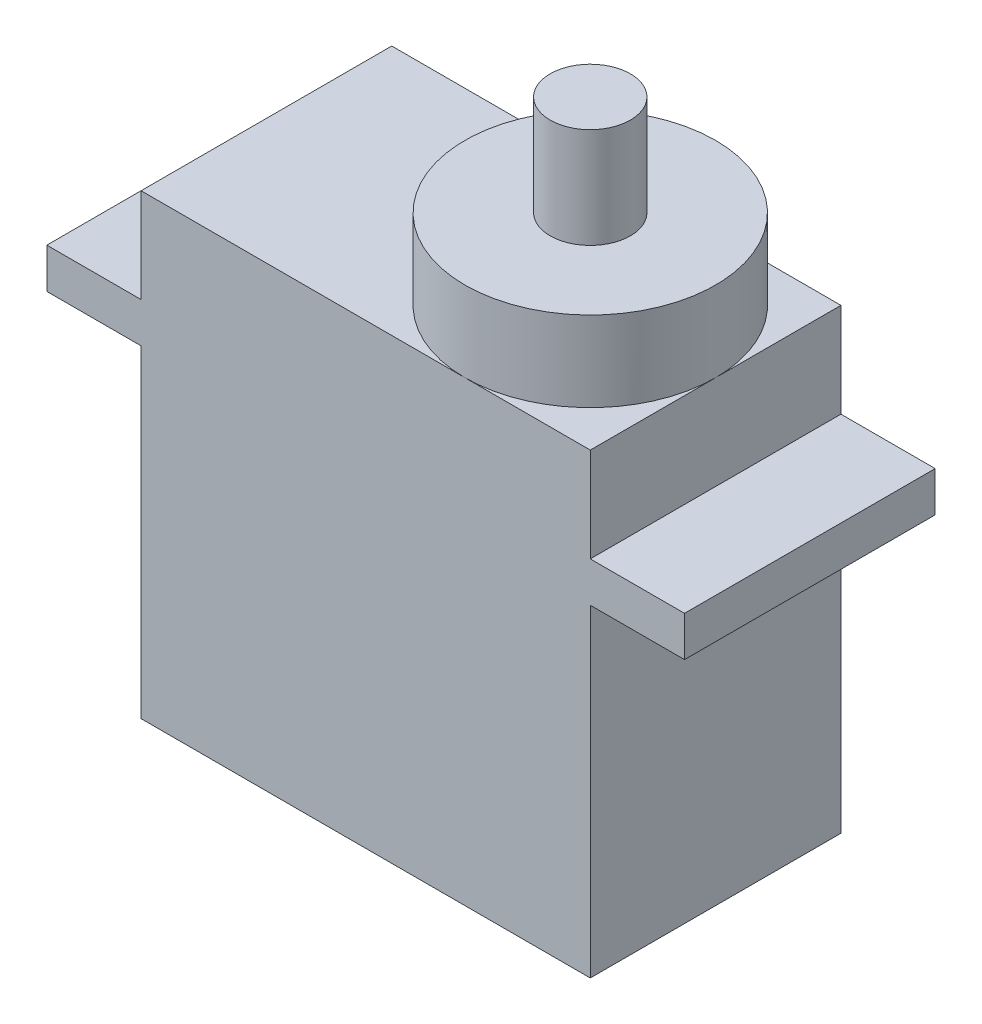
ISO-10303-21;
HEADER;
FILE_DESCRIPTION(('STEP AP214'),'2;1');
FILE_NAME('part.step','',(''),(''),'','','');
FILE_SCHEMA(('AUTOMOTIVE_DESIGN { 1 0 10303 214 1 1 1 1 }'));
ENDSEC;
DATA;
#1=APPLICATION_CONTEXT('core data for automotive mechanical design processes');
#2=APPLICATION_PROTOCOL_DEFINITION('international standard','automotive_design',2000,#1);
#3=PRODUCT_CONTEXT('',#1,'mechanical');
#4=PRODUCT('Part','Part','',(#3));
#5=PRODUCT_RELATED_PRODUCT_CATEGORY('part','',(#4));
#6=PRODUCT_DEFINITION_FORMATION('','',#4);
#7=PRODUCT_DEFINITION_CONTEXT('part definition',#1,'design');
#8=PRODUCT_DEFINITION('design','',#6,#7);
#9=PRODUCT_DEFINITION_SHAPE('','',#8);
#10=(LENGTH_UNIT() NAMED_UNIT(*) SI_UNIT(.MILLI.,.METRE.));
#11=(NAMED_UNIT(*) PLANE_ANGLE_UNIT() SI_UNIT($,.RADIAN.));
#12=(NAMED_UNIT(*) SI_UNIT($,.STERADIAN.) SOLID_ANGLE_UNIT());
#13=UNCERTAINTY_MEASURE_WITH_UNIT(LENGTH_MEASURE(1.E-05),#10,'distance_accuracy_value','');
#14=(GEOMETRIC_REPRESENTATION_CONTEXT(3) GLOBAL_UNCERTAINTY_ASSIGNED_CONTEXT((#13)) GLOBAL_UNIT_ASSIGNED_CONTEXT((#10,
#11,#12)) REPRESENTATION_CONTEXT('',''));
#15=CARTESIAN_POINT('',(0.,0.,0.));
#16=DIRECTION('',(0.,0.,1.));
#17=DIRECTION('',(1.,0.,0.));
#18=AXIS2_PLACEMENT_3D('',#15,#16,#17);
#19=CARTESIAN_POINT('',(11.2,11.4,6.25));
#20=DIRECTION('',(0.,-1.,0.));
#21=DIRECTION('',(0.,0.,-1.));
#22=AXIS2_PLACEMENT_3D('',#19,#20,#21);
#23=PLANE('',#22);
#24=CARTESIAN_POINT('',(4.95,11.4,0.));
#25=DIRECTION('',(0.,1.,0.));
#26=DIRECTION('',(0.,0.,1.));
#27=AXIS2_PLACEMENT_3D('',#24,#25,#26);
#28=CIRCLE('',#27,6.25);
#29=CARTESIAN_POINT('',(4.95,11.4,6.25));
#30=VERTEX_POINT('',#29);
#31=CARTESIAN_POINT('',(11.2,11.4,0.));
#32=VERTEX_POINT('',#31);
#33=EDGE_CURVE('E154',#30,#32,#28,.T.);
#34=ORIENTED_EDGE('',*,*,#33,.F.);
#35=DIRECTION('',(-1.,0.,0.));
#36=VECTOR('',#35,1.);
#37=CARTESIAN_POINT('',(11.2,11.4,6.25));
#38=LINE('',#37,#36);
#39=CARTESIAN_POINT('',(11.2,11.4,6.25));
#40=VERTEX_POINT('',#39);
#41=EDGE_CURVE('E135',#40,#30,#38,.T.);
#42=ORIENTED_EDGE('',*,*,#41,.F.);
#43=DIRECTION('',(0.,0.,-1.));
#44=VECTOR('',#43,1.);
#45=CARTESIAN_POINT('',(11.2,11.4,6.25));
#46=LINE('',#45,#44);
#47=EDGE_CURVE('E155',#40,#32,#46,.T.);
#48=ORIENTED_EDGE('',*,*,#47,.T.);
#49=EDGE_LOOP('',(#34,#42,#48));
#50=FACE_BOUND('',#49,.T.);
#51=ADVANCED_FACE('F35',(#50),#23,.F.);
#52=CARTESIAN_POINT('',(4.95,11.4,-6.25));
#53=VERTEX_POINT('',#52);
#54=EDGE_CURVE('E44',#32,#53,#28,.T.);
#55=ORIENTED_EDGE('',*,*,#54,.F.);
#56=CARTESIAN_POINT('',(11.2,11.4,-6.25));
#57=VERTEX_POINT('',#56);
#58=EDGE_CURVE('E237',#32,#57,#46,.T.);
#59=ORIENTED_EDGE('',*,*,#58,.T.);
#60=DIRECTION('',(-1.,0.,0.));
#61=VECTOR('',#60,1.);
#62=CARTESIAN_POINT('',(11.2,11.4,-6.25));
#63=LINE('',#62,#61);
#64=EDGE_CURVE('E234',#57,#53,#63,.T.);
#65=ORIENTED_EDGE('',*,*,#64,.T.);
#66=EDGE_LOOP('',(#55,#59,#65));
#67=FACE_BOUND('',#66,.T.);
#68=ADVANCED_FACE('F282',(#67),#23,.F.);
#69=CARTESIAN_POINT('',(11.2,-11.4,6.25));
#70=DIRECTION('',(-1.,0.,0.));
#71=DIRECTION('',(0.,-1.,0.));
#72=AXIS2_PLACEMENT_3D('',#69,#70,#71);
#73=PLANE('',#72);
#74=DIRECTION('',(0.,0.,1.));
#75=VECTOR('',#74,1.);
#76=CARTESIAN_POINT('',(11.2,6.7,-6.25));
#77=LINE('',#76,#75);
#78=CARTESIAN_POINT('',(11.2,6.7,-6.25));
#79=VERTEX_POINT('',#78);
#80=CARTESIAN_POINT('',(11.2,6.7,6.25));
#81=VERTEX_POINT('',#80);
#82=EDGE_CURVE('E174',#79,#81,#77,.T.);
#83=ORIENTED_EDGE('',*,*,#82,.F.);
#84=DIRECTION('',(0.,1.,0.));
#85=VECTOR('',#84,1.);
#86=CARTESIAN_POINT('',(11.2,-11.4,-6.25));
#87=LINE('',#86,#85);
#88=EDGE_CURVE('E229',#79,#57,#87,.T.);
#89=ORIENTED_EDGE('',*,*,#88,.T.);
#90=ORIENTED_EDGE('',*,*,#58,.F.);
#91=ORIENTED_EDGE('',*,*,#47,.F.);
#92=DIRECTION('',(0.,1.,0.));
#93=VECTOR('',#92,1.);
#94=CARTESIAN_POINT('',(11.2,-11.4,6.25));
#95=LINE('',#94,#93);
#96=EDGE_CURVE('E142',#81,#40,#95,.T.);
#97=ORIENTED_EDGE('',*,*,#96,.F.);
#98=EDGE_LOOP('',(#83,#89,#90,#91,#97));
#99=FACE_BOUND('',#98,.T.);
#100=ADVANCED_FACE('F280',(#99),#73,.F.);
#101=CARTESIAN_POINT('',(-11.2,-11.4,6.25));
#102=DIRECTION('',(1.,0.,0.));
#103=DIRECTION('',(0.,0.,-1.));
#104=AXIS2_PLACEMENT_3D('',#101,#102,#103);
#105=PLANE('',#104);
#106=DIRECTION('',(0.,0.,1.));
#107=VECTOR('',#106,1.);
#108=CARTESIAN_POINT('',(-11.2,4.7,-6.25));
#109=LINE('',#108,#107);
#110=CARTESIAN_POINT('',(-11.2,4.7,-6.25));
#111=VERTEX_POINT('',#110);
#112=CARTESIAN_POINT('',(-11.2,4.7,6.25));
#113=VERTEX_POINT('',#112);
#114=EDGE_CURVE('E208',#111,#113,#109,.T.);
#115=ORIENTED_EDGE('',*,*,#114,.F.);
#116=DIRECTION('',(0.,-1.,0.));
#117=VECTOR('',#116,1.);
#118=CARTESIAN_POINT('',(-11.2,-11.4,-6.25));
#119=LINE('',#118,#117);
#120=CARTESIAN_POINT('',(-11.2,-11.4,-6.25));
#121=VERTEX_POINT('',#120);
#122=EDGE_CURVE('E210',#111,#121,#119,.T.);
#123=ORIENTED_EDGE('',*,*,#122,.T.);
#124=DIRECTION('',(0.,0.,-1.));
#125=VECTOR('',#124,1.);
#126=CARTESIAN_POINT('',(-11.2,-11.4,6.25));
#127=LINE('',#126,#125);
#128=CARTESIAN_POINT('',(-11.2,-11.4,6.25));
#129=VERTEX_POINT('',#128);
#130=EDGE_CURVE('E39',#129,#121,#127,.T.);
#131=ORIENTED_EDGE('',*,*,#130,.F.);
#132=DIRECTION('',(0.,-1.,0.));
#133=VECTOR('',#132,1.);
#134=CARTESIAN_POINT('',(-11.2,-11.4,6.25));
#135=LINE('',#134,#133);
#136=EDGE_CURVE('E220',#113,#129,#135,.T.);
#137=ORIENTED_EDGE('',*,*,#136,.F.);
#138=EDGE_LOOP('',(#115,#123,#131,#137));
#139=FACE_BOUND('',#138,.T.);
#140=ADVANCED_FACE('F262',(#139),#105,.F.);
#141=CARTESIAN_POINT('',(-11.2,11.4,-6.25));
#142=VERTEX_POINT('',#141);
#143=CARTESIAN_POINT('',(-11.2,6.7,-6.25));
#144=VERTEX_POINT('',#143);
#145=EDGE_CURVE('E224',#142,#144,#119,.T.);
#146=ORIENTED_EDGE('',*,*,#145,.T.);
#147=DIRECTION('',(0.,0.,1.));
#148=VECTOR('',#147,1.);
#149=CARTESIAN_POINT('',(-11.2,6.7,-6.25));
#150=LINE('',#149,#148);
#151=CARTESIAN_POINT('',(-11.2,6.7,6.25));
#152=VERTEX_POINT('',#151);
#153=EDGE_CURVE('E200',#144,#152,#150,.T.);
#154=ORIENTED_EDGE('',*,*,#153,.T.);
#155=CARTESIAN_POINT('',(-11.2,11.4,6.25));
#156=VERTEX_POINT('',#155);
#157=EDGE_CURVE('E217',#156,#152,#135,.T.);
#158=ORIENTED_EDGE('',*,*,#157,.F.);
#159=DIRECTION('',(0.,0.,-1.));
#160=VECTOR('',#159,1.);
#161=CARTESIAN_POINT('',(-11.2,11.4,6.25));
#162=LINE('',#161,#160);
#163=EDGE_CURVE('E147',#156,#142,#162,.T.);
#164=ORIENTED_EDGE('',*,*,#163,.T.);
#165=EDGE_LOOP('',(#146,#154,#158,#164));
#166=FACE_BOUND('',#165,.T.);
#167=ADVANCED_FACE('F37',(#166),#105,.F.);
#168=CARTESIAN_POINT('',(11.2,-11.4,6.25));
#169=DIRECTION('',(0.,1.,0.));
#170=DIRECTION('',(0.,0.,1.));
#171=AXIS2_PLACEMENT_3D('',#168,#169,#170);
#172=PLANE('',#171);
#173=DIRECTION('',(1.,0.,0.));
#174=VECTOR('',#173,1.);
#175=CARTESIAN_POINT('',(11.2,-11.4,-6.25));
#176=LINE('',#175,#174);
#177=CARTESIAN_POINT('',(11.2,-11.4,-6.25));
#178=VERTEX_POINT('',#177);
#179=EDGE_CURVE('E227',#121,#178,#176,.T.);
#180=ORIENTED_EDGE('',*,*,#179,.T.);
#181=DIRECTION('',(0.,0.,-1.));
#182=VECTOR('',#181,1.);
#183=CARTESIAN_POINT('',(11.2,-11.4,6.25));
#184=LINE('',#183,#182);
#185=CARTESIAN_POINT('',(11.2,-11.4,6.25));
#186=VERTEX_POINT('',#185);
#187=EDGE_CURVE('E162',#186,#178,#184,.T.);
#188=ORIENTED_EDGE('',*,*,#187,.F.);
#189=DIRECTION('',(1.,0.,0.));
#190=VECTOR('',#189,1.);
#191=CARTESIAN_POINT('',(11.2,-11.4,6.25));
#192=LINE('',#191,#190);
#193=EDGE_CURVE('E219',#129,#186,#192,.T.);
#194=ORIENTED_EDGE('',*,*,#193,.F.);
#195=ORIENTED_EDGE('',*,*,#130,.T.);
#196=EDGE_LOOP('',(#180,#188,#194,#195));
#197=FACE_BOUND('',#196,.T.);
#198=ADVANCED_FACE('F259',(#197),#172,.F.);
#199=CARTESIAN_POINT('',(11.2,4.7,-6.25));
#200=VERTEX_POINT('',#199);
#201=EDGE_CURVE('E230',#178,#200,#87,.T.);
#202=ORIENTED_EDGE('',*,*,#201,.T.);
#203=DIRECTION('',(0.,0.,1.));
#204=VECTOR('',#203,1.);
#205=CARTESIAN_POINT('',(11.2,4.7,-6.25));
#206=LINE('',#205,#204);
#207=CARTESIAN_POINT('',(11.2,4.7,6.25));
#208=VERTEX_POINT('',#207);
#209=EDGE_CURVE('E187',#200,#208,#206,.T.);
#210=ORIENTED_EDGE('',*,*,#209,.T.);
#211=EDGE_CURVE('E152',#186,#208,#95,.T.);
#212=ORIENTED_EDGE('',*,*,#211,.F.);
#213=ORIENTED_EDGE('',*,*,#187,.T.);
#214=EDGE_LOOP('',(#202,#210,#212,#213));
#215=FACE_BOUND('',#214,.T.);
#216=ADVANCED_FACE('F243',(#215),#73,.F.);
#217=EDGE_CURVE('E59',#53,#30,#28,.T.);
#218=ORIENTED_EDGE('',*,*,#217,.F.);
#219=EDGE_CURVE('E233',#53,#142,#63,.T.);
#220=ORIENTED_EDGE('',*,*,#219,.T.);
#221=ORIENTED_EDGE('',*,*,#163,.F.);
#222=EDGE_CURVE('E138',#30,#156,#38,.T.);
#223=ORIENTED_EDGE('',*,*,#222,.F.);
#224=EDGE_LOOP('',(#218,#220,#221,#223));
#225=FACE_BOUND('',#224,.T.);
#226=ADVANCED_FACE('F149',(#225),#23,.F.);
#227=CARTESIAN_POINT('',(0.,0.,6.25));
#228=DIRECTION('',(0.,0.,1.));
#229=DIRECTION('',(1.,0.,0.));
#230=AXIS2_PLACEMENT_3D('',#227,#228,#229);
#231=PLANE('',#230);
#232=ORIENTED_EDGE('',*,*,#157,.T.);
#233=DIRECTION('',(-1.,0.,0.));
#234=VECTOR('',#233,1.);
#235=CARTESIAN_POINT('',(-15.9,6.7,6.25));
#236=LINE('',#235,#234);
#237=CARTESIAN_POINT('',(-15.9,6.7,6.25));
#238=VERTEX_POINT('',#237);
#239=EDGE_CURVE('E184',#152,#238,#236,.T.);
#240=ORIENTED_EDGE('',*,*,#239,.T.);
#241=DIRECTION('',(0.,-1.,0.));
#242=VECTOR('',#241,1.);
#243=CARTESIAN_POINT('',(-15.9,4.7,6.25));
#244=LINE('',#243,#242);
#245=CARTESIAN_POINT('',(-15.9,4.7,6.25));
#246=VERTEX_POINT('',#245);
#247=EDGE_CURVE('E203',#238,#246,#244,.T.);
#248=ORIENTED_EDGE('',*,*,#247,.T.);
#249=DIRECTION('',(1.,0.,0.));
#250=VECTOR('',#249,1.);
#251=CARTESIAN_POINT('',(-11.2,4.7,6.25));
#252=LINE('',#251,#250);
#253=EDGE_CURVE('E195',#246,#113,#252,.T.);
#254=ORIENTED_EDGE('',*,*,#253,.T.);
#255=ORIENTED_EDGE('',*,*,#136,.T.);
#256=ORIENTED_EDGE('',*,*,#193,.T.);
#257=ORIENTED_EDGE('',*,*,#211,.T.);
#258=DIRECTION('',(1.,0.,0.));
#259=VECTOR('',#258,1.);
#260=CARTESIAN_POINT('',(11.2,4.7,6.25));
#261=LINE('',#260,#259);
#262=CARTESIAN_POINT('',(15.9,4.7,6.25));
#263=VERTEX_POINT('',#262);
#264=EDGE_CURVE('E177',#208,#263,#261,.T.);
#265=ORIENTED_EDGE('',*,*,#264,.T.);
#266=DIRECTION('',(0.,1.,0.));
#267=VECTOR('',#266,1.);
#268=CARTESIAN_POINT('',(15.9,4.7,6.25));
#269=LINE('',#268,#267);
#270=CARTESIAN_POINT('',(15.9,6.7,6.25));
#271=VERTEX_POINT('',#270);
#272=EDGE_CURVE('E168',#263,#271,#269,.T.);
#273=ORIENTED_EDGE('',*,*,#272,.T.);
#274=DIRECTION('',(-1.,0.,0.));
#275=VECTOR('',#274,1.);
#276=CARTESIAN_POINT('',(15.9,6.7,6.25));
#277=LINE('',#276,#275);
#278=EDGE_CURVE('E175',#271,#81,#277,.T.);
#279=ORIENTED_EDGE('',*,*,#278,.T.);
#280=ORIENTED_EDGE('',*,*,#96,.T.);
#281=ORIENTED_EDGE('',*,*,#41,.T.);
#282=ORIENTED_EDGE('',*,*,#222,.T.);
#283=EDGE_LOOP('',(#232,#240,#248,#254,#255,#256,#257,#265,#273,#279,#280,#281,#282));
#284=FACE_BOUND('',#283,.T.);
#285=ADVANCED_FACE('F137',(#284),#231,.T.);
#286=CARTESIAN_POINT('',(0.,0.,-6.25));
#287=DIRECTION('',(0.,0.,1.));
#288=DIRECTION('',(1.,0.,0.));
#289=AXIS2_PLACEMENT_3D('',#286,#287,#288);
#290=PLANE('',#289);
#291=ORIENTED_EDGE('',*,*,#145,.F.);
#292=ORIENTED_EDGE('',*,*,#219,.F.);
#293=ORIENTED_EDGE('',*,*,#64,.F.);
#294=ORIENTED_EDGE('',*,*,#88,.F.);
#295=DIRECTION('',(-1.,0.,0.));
#296=VECTOR('',#295,1.);
#297=CARTESIAN_POINT('',(15.9,6.7,-6.25));
#298=LINE('',#297,#296);
#299=CARTESIAN_POINT('',(15.9,6.7,-6.25));
#300=VERTEX_POINT('',#299);
#301=EDGE_CURVE('E165',#300,#79,#298,.T.);
#302=ORIENTED_EDGE('',*,*,#301,.F.);
#303=DIRECTION('',(0.,1.,0.));
#304=VECTOR('',#303,1.);
#305=CARTESIAN_POINT('',(15.9,4.7,-6.25));
#306=LINE('',#305,#304);
#307=CARTESIAN_POINT('',(15.9,4.7,-6.25));
#308=VERTEX_POINT('',#307);
#309=EDGE_CURVE('E171',#308,#300,#306,.T.);
#310=ORIENTED_EDGE('',*,*,#309,.F.);
#311=DIRECTION('',(1.,0.,0.));
#312=VECTOR('',#311,1.);
#313=CARTESIAN_POINT('',(11.2,4.7,-6.25));
#314=LINE('',#313,#312);
#315=EDGE_CURVE('E167',#200,#308,#314,.T.);
#316=ORIENTED_EDGE('',*,*,#315,.F.);
#317=ORIENTED_EDGE('',*,*,#201,.F.);
#318=ORIENTED_EDGE('',*,*,#179,.F.);
#319=ORIENTED_EDGE('',*,*,#122,.F.);
#320=DIRECTION('',(1.,0.,0.));
#321=VECTOR('',#320,1.);
#322=CARTESIAN_POINT('',(-11.2,4.7,-6.25));
#323=LINE('',#322,#321);
#324=CARTESIAN_POINT('',(-15.9,4.7,-6.25));
#325=VERTEX_POINT('',#324);
#326=EDGE_CURVE('E198',#325,#111,#323,.T.);
#327=ORIENTED_EDGE('',*,*,#326,.F.);
#328=DIRECTION('',(0.,-1.,0.));
#329=VECTOR('',#328,1.);
#330=CARTESIAN_POINT('',(-15.9,4.7,-6.25));
#331=LINE('',#330,#329);
#332=CARTESIAN_POINT('',(-15.9,6.7,-6.25));
#333=VERTEX_POINT('',#332);
#334=EDGE_CURVE('E194',#333,#325,#331,.T.);
#335=ORIENTED_EDGE('',*,*,#334,.F.);
#336=DIRECTION('',(-1.,0.,0.));
#337=VECTOR('',#336,1.);
#338=CARTESIAN_POINT('',(-15.9,6.7,-6.25));
#339=LINE('',#338,#337);
#340=EDGE_CURVE('E191',#144,#333,#339,.T.);
#341=ORIENTED_EDGE('',*,*,#340,.F.);
#342=EDGE_LOOP('',(#291,#292,#293,#294,#302,#310,#316,#317,#318,#319,#327,#335,#341));
#343=FACE_BOUND('',#342,.T.);
#344=ADVANCED_FACE('F250',(#343),#290,.F.);
#345=CARTESIAN_POINT('',(-11.2,4.7,-6.25));
#346=DIRECTION('',(0.,-1.,0.));
#347=DIRECTION('',(1.,0.,0.));
#348=AXIS2_PLACEMENT_3D('',#345,#346,#347);
#349=PLANE('',#348);
#350=ORIENTED_EDGE('',*,*,#253,.F.);
#351=DIRECTION('',(0.,0.,1.));
#352=VECTOR('',#351,1.);
#353=CARTESIAN_POINT('',(-15.9,4.7,-6.25));
#354=LINE('',#353,#352);
#355=EDGE_CURVE('E211',#325,#246,#354,.T.);
#356=ORIENTED_EDGE('',*,*,#355,.F.);
#357=ORIENTED_EDGE('',*,*,#326,.T.);
#358=ORIENTED_EDGE('',*,*,#114,.T.);
#359=EDGE_LOOP('',(#350,#356,#357,#358));
#360=FACE_BOUND('',#359,.T.);
#361=ADVANCED_FACE('F268',(#360),#349,.T.);
#362=CARTESIAN_POINT('',(-15.9,4.7,-6.25));
#363=DIRECTION('',(-1.,0.,0.));
#364=DIRECTION('',(0.,0.,1.));
#365=AXIS2_PLACEMENT_3D('',#362,#363,#364);
#366=PLANE('',#365);
#367=ORIENTED_EDGE('',*,*,#247,.F.);
#368=DIRECTION('',(0.,0.,1.));
#369=VECTOR('',#368,1.);
#370=CARTESIAN_POINT('',(-15.9,6.7,-6.25));
#371=LINE('',#370,#369);
#372=EDGE_CURVE('E213',#333,#238,#371,.T.);
#373=ORIENTED_EDGE('',*,*,#372,.F.);
#374=ORIENTED_EDGE('',*,*,#334,.T.);
#375=ORIENTED_EDGE('',*,*,#355,.T.);
#376=EDGE_LOOP('',(#367,#373,#374,#375));
#377=FACE_BOUND('',#376,.T.);
#378=ADVANCED_FACE('F271',(#377),#366,.T.);
#379=CARTESIAN_POINT('',(-15.9,6.7,-6.25));
#380=DIRECTION('',(0.,1.,0.));
#381=DIRECTION('',(-1.,0.,0.));
#382=AXIS2_PLACEMENT_3D('',#379,#380,#381);
#383=PLANE('',#382);
#384=ORIENTED_EDGE('',*,*,#239,.F.);
#385=ORIENTED_EDGE('',*,*,#153,.F.);
#386=ORIENTED_EDGE('',*,*,#340,.T.);
#387=ORIENTED_EDGE('',*,*,#372,.T.);
#388=EDGE_LOOP('',(#384,#385,#386,#387));
#389=FACE_BOUND('',#388,.T.);
#390=ADVANCED_FACE('F273',(#389),#383,.T.);
#391=CARTESIAN_POINT('',(15.9,6.7,-6.25));
#392=DIRECTION('',(0.,1.,0.));
#393=DIRECTION('',(-1.,0.,0.));
#394=AXIS2_PLACEMENT_3D('',#391,#392,#393);
#395=PLANE('',#394);
#396=ORIENTED_EDGE('',*,*,#278,.F.);
#397=DIRECTION('',(0.,0.,1.));
#398=VECTOR('',#397,1.);
#399=CARTESIAN_POINT('',(15.9,6.7,-6.25));
#400=LINE('',#399,#398);
#401=EDGE_CURVE('E182',#300,#271,#400,.T.);
#402=ORIENTED_EDGE('',*,*,#401,.F.);
#403=ORIENTED_EDGE('',*,*,#301,.T.);
#404=ORIENTED_EDGE('',*,*,#82,.T.);
#405=EDGE_LOOP('',(#396,#402,#403,#404));
#406=FACE_BOUND('',#405,.T.);
#407=ADVANCED_FACE('F309',(#406),#395,.T.);
#408=CARTESIAN_POINT('',(15.9,4.7,-6.25));
#409=DIRECTION('',(1.,0.,0.));
#410=DIRECTION('',(0.,0.,-1.));
#411=AXIS2_PLACEMENT_3D('',#408,#409,#410);
#412=PLANE('',#411);
#413=ORIENTED_EDGE('',*,*,#272,.F.);
#414=DIRECTION('',(0.,0.,1.));
#415=VECTOR('',#414,1.);
#416=CARTESIAN_POINT('',(15.9,4.7,-6.25));
#417=LINE('',#416,#415);
#418=EDGE_CURVE('E185',#308,#263,#417,.T.);
#419=ORIENTED_EDGE('',*,*,#418,.F.);
#420=ORIENTED_EDGE('',*,*,#309,.T.);
#421=ORIENTED_EDGE('',*,*,#401,.T.);
#422=EDGE_LOOP('',(#413,#419,#420,#421));
#423=FACE_BOUND('',#422,.T.);
#424=ADVANCED_FACE('F308',(#423),#412,.T.);
#425=CARTESIAN_POINT('',(11.2,4.7,-6.25));
#426=DIRECTION('',(0.,-1.,0.));
#427=DIRECTION('',(0.,0.,-1.));
#428=AXIS2_PLACEMENT_3D('',#425,#426,#427);
#429=PLANE('',#428);
#430=ORIENTED_EDGE('',*,*,#264,.F.);
#431=ORIENTED_EDGE('',*,*,#209,.F.);
#432=ORIENTED_EDGE('',*,*,#315,.T.);
#433=ORIENTED_EDGE('',*,*,#418,.T.);
#434=EDGE_LOOP('',(#430,#431,#432,#433));
#435=FACE_BOUND('',#434,.T.);
#436=ADVANCED_FACE('F255',(#435),#429,.T.);
#437=CARTESIAN_POINT('',(4.95,15.4,0.));
#438=DIRECTION('',(0.,-1.,0.));
#439=DIRECTION('',(0.,0.,-1.));
#440=AXIS2_PLACEMENT_3D('',#437,#438,#439);
#441=CYLINDRICAL_SURFACE('',#440,6.25);
#442=CARTESIAN_POINT('',(4.95,15.4,0.));
#443=DIRECTION('',(0.,1.,0.));
#444=DIRECTION('',(0.,0.,1.));
#445=AXIS2_PLACEMENT_3D('',#442,#443,#444);
#446=CIRCLE('',#445,6.25);
#447=CARTESIAN_POINT('',(4.95,15.4,6.25));
#448=VERTEX_POINT('',#447);
#449=EDGE_CURVE('E157',#448,#448,#446,.T.);
#450=ORIENTED_EDGE('',*,*,#449,.F.);
#451=EDGE_LOOP('',(#450));
#452=FACE_BOUND('',#451,.T.);
#453=ORIENTED_EDGE('',*,*,#33,.T.);
#454=ORIENTED_EDGE('',*,*,#54,.T.);
#455=ORIENTED_EDGE('',*,*,#217,.T.);
#456=EDGE_LOOP('',(#453,#454,#455));
#457=FACE_BOUND('',#456,.T.);
#458=ADVANCED_FACE('F160',(#452,#457),#441,.T.);
#459=CARTESIAN_POINT('',(4.95,15.4,0.));
#460=DIRECTION('',(0.,1.,0.));
#461=DIRECTION('',(0.,0.,1.));
#462=AXIS2_PLACEMENT_3D('',#459,#460,#461);
#463=PLANE('',#462);
#464=CARTESIAN_POINT('',(4.95,15.4,0.));
#465=DIRECTION('',(0.,1.,0.));
#466=DIRECTION('',(0.,0.,1.));
#467=AXIS2_PLACEMENT_3D('',#464,#465,#466);
#468=CIRCLE('',#467,2.);
#469=CARTESIAN_POINT('',(4.95,15.4,2.));
#470=VERTEX_POINT('',#469);
#471=EDGE_CURVE('E11',#470,#470,#468,.T.);
#472=ORIENTED_EDGE('',*,*,#471,.F.);
#473=EDGE_LOOP('',(#472));
#474=FACE_BOUND('',#473,.T.);
#475=ORIENTED_EDGE('',*,*,#449,.T.);
#476=EDGE_LOOP('',(#475));
#477=FACE_BOUND('',#476,.T.);
#478=ADVANCED_FACE('F427',(#474,#477),#463,.T.);
#479=CARTESIAN_POINT('',(4.95,20.4,0.));
#480=DIRECTION('',(0.,-1.,0.));
#481=DIRECTION('',(0.,0.,-1.));
#482=AXIS2_PLACEMENT_3D('',#479,#480,#481);
#483=CYLINDRICAL_SURFACE('',#482,2.);
#484=CARTESIAN_POINT('',(4.95,20.4,0.));
#485=DIRECTION('',(0.,1.,0.));
#486=DIRECTION('',(0.,0.,1.));
#487=AXIS2_PLACEMENT_3D('',#484,#485,#486);
#488=CIRCLE('',#487,2.);
#489=CARTESIAN_POINT('',(4.95,20.4,2.));
#490=VERTEX_POINT('',#489);
#491=EDGE_CURVE('E158',#490,#490,#488,.T.);
#492=ORIENTED_EDGE('',*,*,#491,.F.);
#493=EDGE_LOOP('',(#492));
#494=FACE_BOUND('',#493,.T.);
#495=ORIENTED_EDGE('',*,*,#471,.T.);
#496=EDGE_LOOP('',(#495));
#497=FACE_BOUND('',#496,.T.);
#498=ADVANCED_FACE('F436',(#494,#497),#483,.T.);
#499=CARTESIAN_POINT('',(4.95,20.4,0.));
#500=DIRECTION('',(0.,1.,0.));
#501=DIRECTION('',(0.,0.,1.));
#502=AXIS2_PLACEMENT_3D('',#499,#500,#501);
#503=PLANE('',#502);
#504=ORIENTED_EDGE('',*,*,#491,.T.);
#505=EDGE_LOOP('',(#504));
#506=FACE_BOUND('',#505,.T.);
#507=ADVANCED_FACE('F445',(#506),#503,.T.);
#508=CLOSED_SHELL('',(#51,#68,#100,#140,#167,#198,#216,#226,#285,#344,#361,#378,#390,#407,#424,
#436,#458,#478,#498,#507));
#509=MANIFOLD_SOLID_BREP('B2',#508);
#510=ADVANCED_BREP_SHAPE_REPRESENTATION('',(#18,#509),#14);
#511=SHAPE_DEFINITION_REPRESENTATION(#9,#510);
ENDSEC;
END-ISO-10303-21;
